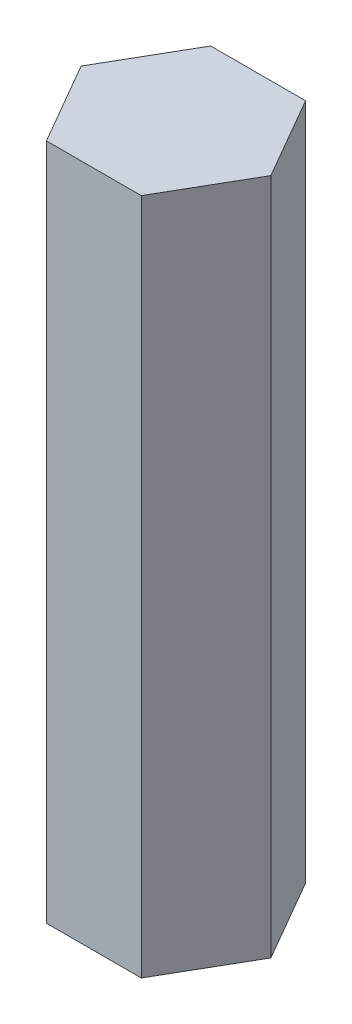
ISO-10303-21;
HEADER;
FILE_DESCRIPTION(('STEP AP214'),'2;1');
FILE_NAME('part.step','',(''),(''),'','','');
FILE_SCHEMA(('AUTOMOTIVE_DESIGN { 1 0 10303 214 1 1 1 1 }'));
ENDSEC;
DATA;
#1=APPLICATION_CONTEXT('core data for automotive mechanical design processes');
#2=APPLICATION_PROTOCOL_DEFINITION('international standard','automotive_design',2000,#1);
#3=PRODUCT_CONTEXT('',#1,'mechanical');
#4=PRODUCT('Part','Part','',(#3));
#5=PRODUCT_RELATED_PRODUCT_CATEGORY('part','',(#4));
#6=PRODUCT_DEFINITION_FORMATION('','',#4);
#7=PRODUCT_DEFINITION_CONTEXT('part definition',#1,'design');
#8=PRODUCT_DEFINITION('design','',#6,#7);
#9=PRODUCT_DEFINITION_SHAPE('','',#8);
#10=(LENGTH_UNIT() NAMED_UNIT(*) SI_UNIT(.MILLI.,.METRE.));
#11=(NAMED_UNIT(*) PLANE_ANGLE_UNIT() SI_UNIT($,.RADIAN.));
#12=(NAMED_UNIT(*) SI_UNIT($,.STERADIAN.) SOLID_ANGLE_UNIT());
#13=UNCERTAINTY_MEASURE_WITH_UNIT(LENGTH_MEASURE(1.E-05),#10,'distance_accuracy_value','');
#14=(GEOMETRIC_REPRESENTATION_CONTEXT(3) GLOBAL_UNCERTAINTY_ASSIGNED_CONTEXT((#13)) GLOBAL_UNIT_ASSIGNED_CONTEXT((#10,
#11,#12)) REPRESENTATION_CONTEXT('',''));
#15=CARTESIAN_POINT('',(0.,0.,0.));
#16=DIRECTION('',(0.,0.,1.));
#17=DIRECTION('',(1.,0.,0.));
#18=AXIS2_PLACEMENT_3D('',#15,#16,#17);
#19=CARTESIAN_POINT('',(350.,5000.,606.217782649107));
#20=DIRECTION('',(-0.866025403784439,0.,-0.5));
#21=DIRECTION('',(-0.5,0.,0.866025403784439));
#22=AXIS2_PLACEMENT_3D('',#19,#20,#21);
#23=PLANE('',#22);
#24=DIRECTION('',(0.5,0.,-0.866025403784439));
#25=VECTOR('',#24,1.);
#26=CARTESIAN_POINT('',(350.,0.,606.217782649107));
#27=LINE('',#26,#25);
#28=CARTESIAN_POINT('',(350.,0.,606.217782649107));
#29=VERTEX_POINT('',#28);
#30=CARTESIAN_POINT('',(700.,0.,0.));
#31=VERTEX_POINT('',#30);
#32=EDGE_CURVE('E124',#29,#31,#27,.T.);
#33=ORIENTED_EDGE('',*,*,#32,.T.);
#34=DIRECTION('',(0.,-1.,0.));
#35=VECTOR('',#34,1.);
#36=CARTESIAN_POINT('',(700.,5000.,0.));
#37=LINE('',#36,#35);
#38=CARTESIAN_POINT('',(700.,5000.,0.));
#39=VERTEX_POINT('',#38);
#40=EDGE_CURVE('E11',#39,#31,#37,.T.);
#41=ORIENTED_EDGE('',*,*,#40,.F.);
#42=DIRECTION('',(0.5,0.,-0.866025403784439));
#43=VECTOR('',#42,1.);
#44=CARTESIAN_POINT('',(350.,5000.,606.217782649107));
#45=LINE('',#44,#43);
#46=CARTESIAN_POINT('',(350.,5000.,606.217782649107));
#47=VERTEX_POINT('',#46);
#48=EDGE_CURVE('E134',#47,#39,#45,.T.);
#49=ORIENTED_EDGE('',*,*,#48,.F.);
#50=DIRECTION('',(0.,-1.,0.));
#51=VECTOR('',#50,1.);
#52=CARTESIAN_POINT('',(350.,5000.,606.217782649107));
#53=LINE('',#52,#51);
#54=EDGE_CURVE('E120',#47,#29,#53,.T.);
#55=ORIENTED_EDGE('',*,*,#54,.T.);
#56=EDGE_LOOP('',(#33,#41,#49,#55));
#57=FACE_BOUND('',#56,.T.);
#58=ADVANCED_FACE('F40',(#57),#23,.F.);
#59=CARTESIAN_POINT('',(700.,5000.,0.));
#60=DIRECTION('',(-0.866025403784439,0.,0.5));
#61=DIRECTION('',(0.5,0.,0.866025403784439));
#62=AXIS2_PLACEMENT_3D('',#59,#60,#61);
#63=PLANE('',#62);
#64=DIRECTION('',(-0.5,0.,-0.866025403784439));
#65=VECTOR('',#64,1.);
#66=CARTESIAN_POINT('',(700.,0.,0.));
#67=LINE('',#66,#65);
#68=CARTESIAN_POINT('',(350.,0.,-606.217782649107));
#69=VERTEX_POINT('',#68);
#70=EDGE_CURVE('E127',#31,#69,#67,.T.);
#71=ORIENTED_EDGE('',*,*,#70,.T.);
#72=DIRECTION('',(0.,-1.,0.));
#73=VECTOR('',#72,1.);
#74=CARTESIAN_POINT('',(350.,5000.,-606.217782649107));
#75=LINE('',#74,#73);
#76=CARTESIAN_POINT('',(350.,5000.,-606.217782649107));
#77=VERTEX_POINT('',#76);
#78=EDGE_CURVE('E48',#77,#69,#75,.T.);
#79=ORIENTED_EDGE('',*,*,#78,.F.);
#80=DIRECTION('',(-0.5,0.,-0.866025403784439));
#81=VECTOR('',#80,1.);
#82=CARTESIAN_POINT('',(700.,5000.,0.));
#83=LINE('',#82,#81);
#84=EDGE_CURVE('E93',#39,#77,#83,.T.);
#85=ORIENTED_EDGE('',*,*,#84,.F.);
#86=ORIENTED_EDGE('',*,*,#40,.T.);
#87=EDGE_LOOP('',(#71,#79,#85,#86));
#88=FACE_BOUND('',#87,.T.);
#89=ADVANCED_FACE('F158',(#88),#63,.F.);
#90=CARTESIAN_POINT('',(350.,5000.,-606.217782649107));
#91=DIRECTION('',(0.,0.,1.));
#92=DIRECTION('',(1.,0.,0.));
#93=AXIS2_PLACEMENT_3D('',#90,#91,#92);
#94=PLANE('',#93);
#95=DIRECTION('',(-1.,0.,0.));
#96=VECTOR('',#95,1.);
#97=CARTESIAN_POINT('',(350.,0.,-606.217782649107));
#98=LINE('',#97,#96);
#99=CARTESIAN_POINT('',(-350.,0.,-606.217782649107));
#100=VERTEX_POINT('',#99);
#101=EDGE_CURVE('E129',#69,#100,#98,.T.);
#102=ORIENTED_EDGE('',*,*,#101,.T.);
#103=DIRECTION('',(0.,-1.,0.));
#104=VECTOR('',#103,1.);
#105=CARTESIAN_POINT('',(-350.,5000.,-606.217782649107));
#106=LINE('',#105,#104);
#107=CARTESIAN_POINT('',(-350.,5000.,-606.217782649107));
#108=VERTEX_POINT('',#107);
#109=EDGE_CURVE('E115',#108,#100,#106,.T.);
#110=ORIENTED_EDGE('',*,*,#109,.F.);
#111=DIRECTION('',(-1.,0.,0.));
#112=VECTOR('',#111,1.);
#113=CARTESIAN_POINT('',(350.,5000.,-606.217782649107));
#114=LINE('',#113,#112);
#115=EDGE_CURVE('E106',#77,#108,#114,.T.);
#116=ORIENTED_EDGE('',*,*,#115,.F.);
#117=ORIENTED_EDGE('',*,*,#78,.T.);
#118=EDGE_LOOP('',(#102,#110,#116,#117));
#119=FACE_BOUND('',#118,.T.);
#120=ADVANCED_FACE('F140',(#119),#94,.F.);
#121=CARTESIAN_POINT('',(-350.,5000.,-606.217782649107));
#122=DIRECTION('',(0.866025403784439,0.,0.5));
#123=DIRECTION('',(0.5,0.,-0.866025403784439));
#124=AXIS2_PLACEMENT_3D('',#121,#122,#123);
#125=PLANE('',#124);
#126=DIRECTION('',(-0.5,0.,0.866025403784439));
#127=VECTOR('',#126,1.);
#128=CARTESIAN_POINT('',(-350.,0.,-606.217782649107));
#129=LINE('',#128,#127);
#130=CARTESIAN_POINT('',(-700.,0.,0.));
#131=VERTEX_POINT('',#130);
#132=EDGE_CURVE('E114',#100,#131,#129,.T.);
#133=ORIENTED_EDGE('',*,*,#132,.T.);
#134=DIRECTION('',(0.,-1.,0.));
#135=VECTOR('',#134,1.);
#136=CARTESIAN_POINT('',(-700.,5000.,0.));
#137=LINE('',#136,#135);
#138=CARTESIAN_POINT('',(-700.,5000.,0.));
#139=VERTEX_POINT('',#138);
#140=EDGE_CURVE('E111',#139,#131,#137,.T.);
#141=ORIENTED_EDGE('',*,*,#140,.F.);
#142=DIRECTION('',(-0.5,0.,0.866025403784439));
#143=VECTOR('',#142,1.);
#144=CARTESIAN_POINT('',(-350.,5000.,-606.217782649107));
#145=LINE('',#144,#143);
#146=EDGE_CURVE('E100',#108,#139,#145,.T.);
#147=ORIENTED_EDGE('',*,*,#146,.F.);
#148=ORIENTED_EDGE('',*,*,#109,.T.);
#149=EDGE_LOOP('',(#133,#141,#147,#148));
#150=FACE_BOUND('',#149,.T.);
#151=ADVANCED_FACE('F112',(#150),#125,.F.);
#152=CARTESIAN_POINT('',(-700.,5000.,0.));
#153=DIRECTION('',(0.866025403784439,0.,-0.5));
#154=DIRECTION('',(-0.5,0.,-0.866025403784439));
#155=AXIS2_PLACEMENT_3D('',#152,#153,#154);
#156=PLANE('',#155);
#157=DIRECTION('',(0.5,0.,0.866025403784439));
#158=VECTOR('',#157,1.);
#159=CARTESIAN_POINT('',(-700.,0.,0.));
#160=LINE('',#159,#158);
#161=CARTESIAN_POINT('',(-350.,0.,606.217782649107));
#162=VERTEX_POINT('',#161);
#163=EDGE_CURVE('E79',#131,#162,#160,.T.);
#164=ORIENTED_EDGE('',*,*,#163,.T.);
#165=DIRECTION('',(0.,-1.,0.));
#166=VECTOR('',#165,1.);
#167=CARTESIAN_POINT('',(-350.,5000.,606.217782649107));
#168=LINE('',#167,#166);
#169=CARTESIAN_POINT('',(-350.,5000.,606.217782649107));
#170=VERTEX_POINT('',#169);
#171=EDGE_CURVE('E116',#170,#162,#168,.T.);
#172=ORIENTED_EDGE('',*,*,#171,.F.);
#173=DIRECTION('',(0.5,0.,0.866025403784439));
#174=VECTOR('',#173,1.);
#175=CARTESIAN_POINT('',(-700.,5000.,0.));
#176=LINE('',#175,#174);
#177=EDGE_CURVE('E104',#139,#170,#176,.T.);
#178=ORIENTED_EDGE('',*,*,#177,.F.);
#179=ORIENTED_EDGE('',*,*,#140,.T.);
#180=EDGE_LOOP('',(#164,#172,#178,#179));
#181=FACE_BOUND('',#180,.T.);
#182=ADVANCED_FACE('F118',(#181),#156,.F.);
#183=CARTESIAN_POINT('',(-350.,5000.,606.217782649107));
#184=DIRECTION('',(0.,0.,-1.));
#185=DIRECTION('',(-1.,0.,0.));
#186=AXIS2_PLACEMENT_3D('',#183,#184,#185);
#187=PLANE('',#186);
#188=DIRECTION('',(1.,0.,0.));
#189=VECTOR('',#188,1.);
#190=CARTESIAN_POINT('',(-350.,0.,606.217782649107));
#191=LINE('',#190,#189);
#192=EDGE_CURVE('E85',#162,#29,#191,.T.);
#193=ORIENTED_EDGE('',*,*,#192,.T.);
#194=ORIENTED_EDGE('',*,*,#54,.F.);
#195=DIRECTION('',(1.,0.,0.));
#196=VECTOR('',#195,1.);
#197=CARTESIAN_POINT('',(-350.,5000.,606.217782649107));
#198=LINE('',#197,#196);
#199=EDGE_CURVE('E56',#170,#47,#198,.T.);
#200=ORIENTED_EDGE('',*,*,#199,.F.);
#201=ORIENTED_EDGE('',*,*,#171,.T.);
#202=EDGE_LOOP('',(#193,#194,#200,#201));
#203=FACE_BOUND('',#202,.T.);
#204=ADVANCED_FACE('F147',(#203),#187,.F.);
#205=CARTESIAN_POINT('',(0.,5000.,0.));
#206=DIRECTION('',(0.,1.,0.));
#207=DIRECTION('',(0.,0.,1.));
#208=AXIS2_PLACEMENT_3D('',#205,#206,#207);
#209=PLANE('',#208);
#210=ORIENTED_EDGE('',*,*,#48,.T.);
#211=ORIENTED_EDGE('',*,*,#84,.T.);
#212=ORIENTED_EDGE('',*,*,#115,.T.);
#213=ORIENTED_EDGE('',*,*,#146,.T.);
#214=ORIENTED_EDGE('',*,*,#177,.T.);
#215=ORIENTED_EDGE('',*,*,#199,.T.);
#216=EDGE_LOOP('',(#210,#211,#212,#213,#214,#215));
#217=FACE_BOUND('',#216,.T.);
#218=ADVANCED_FACE('F102',(#217),#209,.T.);
#219=CARTESIAN_POINT('',(0.,0.,0.));
#220=DIRECTION('',(0.,1.,0.));
#221=DIRECTION('',(0.,0.,1.));
#222=AXIS2_PLACEMENT_3D('',#219,#220,#221);
#223=PLANE('',#222);
#224=ORIENTED_EDGE('',*,*,#32,.F.);
#225=ORIENTED_EDGE('',*,*,#192,.F.);
#226=ORIENTED_EDGE('',*,*,#163,.F.);
#227=ORIENTED_EDGE('',*,*,#132,.F.);
#228=ORIENTED_EDGE('',*,*,#101,.F.);
#229=ORIENTED_EDGE('',*,*,#70,.F.);
#230=EDGE_LOOP('',(#224,#225,#226,#227,#228,#229));
#231=FACE_BOUND('',#230,.T.);
#232=ADVANCED_FACE('F143',(#231),#223,.F.);
#233=CLOSED_SHELL('',(#58,#89,#120,#151,#182,#204,#218,#232));
#234=MANIFOLD_SOLID_BREP('B2',#233);
#235=ADVANCED_BREP_SHAPE_REPRESENTATION('',(#18,#234),#14);
#236=SHAPE_DEFINITION_REPRESENTATION(#9,#235);
ENDSEC;
END-ISO-10303-21;
